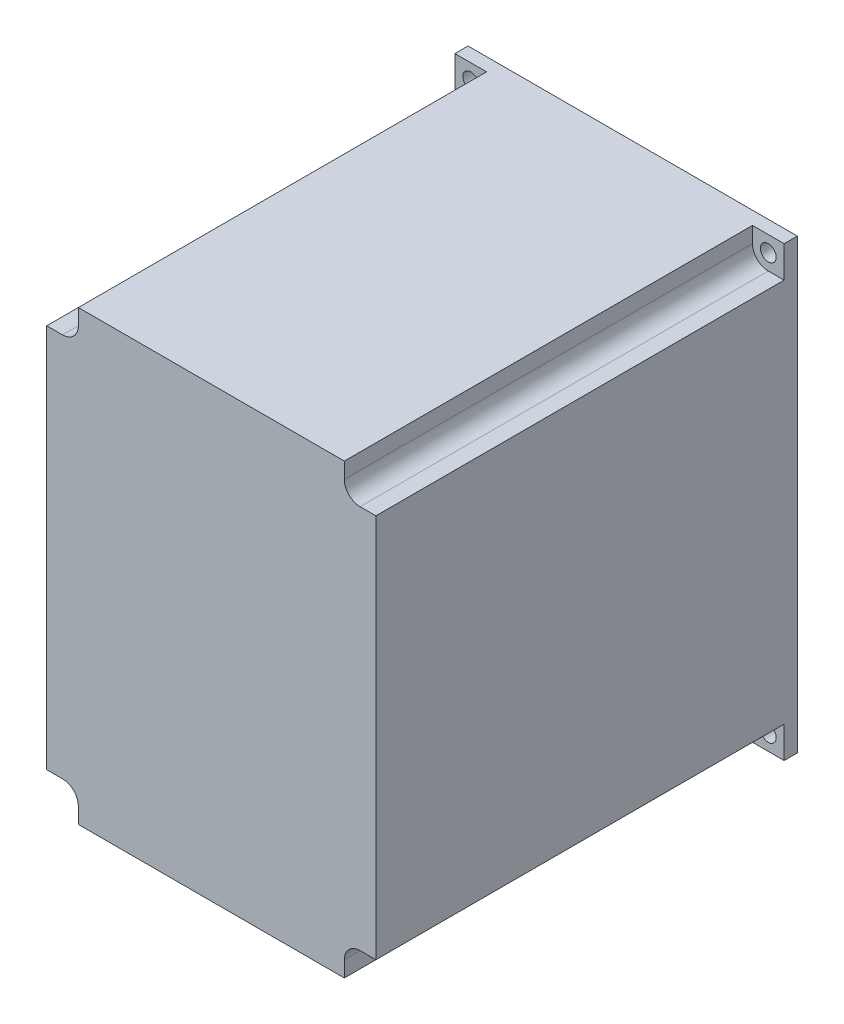
ISO-10303-21;
HEADER;
FILE_DESCRIPTION(('STEP AP214'),'2;1');
FILE_NAME('part.step','',(''),(''),'','','');
FILE_SCHEMA(('AUTOMOTIVE_DESIGN { 1 0 10303 214 1 1 1 1 }'));
ENDSEC;
DATA;
#1=APPLICATION_CONTEXT('core data for automotive mechanical design processes');
#2=APPLICATION_PROTOCOL_DEFINITION('international standard','automotive_design',2000,#1);
#3=PRODUCT_CONTEXT('',#1,'mechanical');
#4=PRODUCT('Part','Part','',(#3));
#5=PRODUCT_RELATED_PRODUCT_CATEGORY('part','',(#4));
#6=PRODUCT_DEFINITION_FORMATION('','',#4);
#7=PRODUCT_DEFINITION_CONTEXT('part definition',#1,'design');
#8=PRODUCT_DEFINITION('design','',#6,#7);
#9=PRODUCT_DEFINITION_SHAPE('','',#8);
#10=(LENGTH_UNIT() NAMED_UNIT(*) SI_UNIT(.MILLI.,.METRE.));
#11=(NAMED_UNIT(*) PLANE_ANGLE_UNIT() SI_UNIT($,.RADIAN.));
#12=(NAMED_UNIT(*) SI_UNIT($,.STERADIAN.) SOLID_ANGLE_UNIT());
#13=UNCERTAINTY_MEASURE_WITH_UNIT(LENGTH_MEASURE(1.E-05),#10,'distance_accuracy_value','');
#14=(GEOMETRIC_REPRESENTATION_CONTEXT(3) GLOBAL_UNCERTAINTY_ASSIGNED_CONTEXT((#13)) GLOBAL_UNIT_ASSIGNED_CONTEXT((#10,
#11,#12)) REPRESENTATION_CONTEXT('',''));
#15=CARTESIAN_POINT('',(0.,0.,0.));
#16=DIRECTION('',(0.,0.,1.));
#17=DIRECTION('',(1.,0.,0.));
#18=AXIS2_PLACEMENT_3D('',#15,#16,#17);
#19=CARTESIAN_POINT('',(62.5,85.,160.));
#20=DIRECTION('',(-1.,0.,0.));
#21=DIRECTION('',(0.,-1.,0.));
#22=AXIS2_PLACEMENT_3D('',#19,#20,#21);
#23=PLANE('',#22);
#24=DIRECTION('',(0.,1.,0.));
#25=VECTOR('',#24,1.);
#26=CARTESIAN_POINT('',(62.5,0.,5.));
#27=LINE('',#26,#25);
#28=CARTESIAN_POINT('',(62.5,73.,5.));
#29=VERTEX_POINT('',#28);
#30=CARTESIAN_POINT('',(62.5,85.,5.));
#31=VERTEX_POINT('',#30);
#32=EDGE_CURVE('E203',#29,#31,#27,.T.);
#33=ORIENTED_EDGE('',*,*,#32,.F.);
#34=DIRECTION('',(0.,0.,1.));
#35=VECTOR('',#34,1.);
#36=CARTESIAN_POINT('',(62.5,73.,-16.9705627484771));
#37=LINE('',#36,#35);
#38=CARTESIAN_POINT('',(62.5,73.,160.));
#39=VERTEX_POINT('',#38);
#40=EDGE_CURVE('E190',#29,#39,#37,.T.);
#41=ORIENTED_EDGE('',*,*,#40,.T.);
#42=DIRECTION('',(0.,1.,0.));
#43=VECTOR('',#42,1.);
#44=CARTESIAN_POINT('',(62.5,85.,160.));
#45=LINE('',#44,#43);
#46=CARTESIAN_POINT('',(62.5,-73.,160.));
#47=VERTEX_POINT('',#46);
#48=EDGE_CURVE('E201',#47,#39,#45,.T.);
#49=ORIENTED_EDGE('',*,*,#48,.F.);
#50=DIRECTION('',(0.,0.,1.));
#51=VECTOR('',#50,1.);
#52=CARTESIAN_POINT('',(62.5,-73.,-16.9705627484771));
#53=LINE('',#52,#51);
#54=CARTESIAN_POINT('',(62.5,-73.,5.));
#55=VERTEX_POINT('',#54);
#56=EDGE_CURVE('E289',#55,#47,#53,.T.);
#57=ORIENTED_EDGE('',*,*,#56,.F.);
#58=DIRECTION('',(0.,-1.,0.));
#59=VECTOR('',#58,1.);
#60=CARTESIAN_POINT('',(62.5,0.,5.));
#61=LINE('',#60,#59);
#62=CARTESIAN_POINT('',(62.5,-85.,5.));
#63=VERTEX_POINT('',#62);
#64=EDGE_CURVE('E273',#55,#63,#61,.T.);
#65=ORIENTED_EDGE('',*,*,#64,.T.);
#66=DIRECTION('',(0.,0.,-1.));
#67=VECTOR('',#66,1.);
#68=CARTESIAN_POINT('',(62.5,-85.,160.));
#69=LINE('',#68,#67);
#70=CARTESIAN_POINT('',(62.5,-85.,0.));
#71=VERTEX_POINT('',#70);
#72=EDGE_CURVE('E227',#63,#71,#69,.T.);
#73=ORIENTED_EDGE('',*,*,#72,.T.);
#74=DIRECTION('',(0.,1.,0.));
#75=VECTOR('',#74,1.);
#76=CARTESIAN_POINT('',(62.5,85.,0.));
#77=LINE('',#76,#75);
#78=CARTESIAN_POINT('',(62.5,85.,0.));
#79=VERTEX_POINT('',#78);
#80=EDGE_CURVE('E228',#71,#79,#77,.T.);
#81=ORIENTED_EDGE('',*,*,#80,.T.);
#82=DIRECTION('',(0.,0.,-1.));
#83=VECTOR('',#82,1.);
#84=CARTESIAN_POINT('',(62.5,85.,160.));
#85=LINE('',#84,#83);
#86=EDGE_CURVE('E12',#31,#79,#85,.T.);
#87=ORIENTED_EDGE('',*,*,#86,.F.);
#88=EDGE_LOOP('',(#33,#41,#49,#57,#65,#73,#81,#87));
#89=FACE_BOUND('',#88,.T.);
#90=ADVANCED_FACE('F42',(#89),#23,.F.);
#91=CARTESIAN_POINT('',(-62.5,-85.,160.));
#92=DIRECTION('',(0.,1.,0.));
#93=DIRECTION('',(0.,0.,1.));
#94=AXIS2_PLACEMENT_3D('',#91,#92,#93);
#95=PLANE('',#94);
#96=DIRECTION('',(0.,0.,1.));
#97=VECTOR('',#96,1.);
#98=CARTESIAN_POINT('',(50.5,-85.,-16.9705627484771));
#99=LINE('',#98,#97);
#100=CARTESIAN_POINT('',(50.5,-85.,5.));
#101=VERTEX_POINT('',#100);
#102=CARTESIAN_POINT('',(50.5,-85.,160.));
#103=VERTEX_POINT('',#102);
#104=EDGE_CURVE('E291',#101,#103,#99,.T.);
#105=ORIENTED_EDGE('',*,*,#104,.T.);
#106=DIRECTION('',(1.,0.,0.));
#107=VECTOR('',#106,1.);
#108=CARTESIAN_POINT('',(-62.5,-85.,160.));
#109=LINE('',#108,#107);
#110=CARTESIAN_POINT('',(-50.5,-85.,160.));
#111=VERTEX_POINT('',#110);
#112=EDGE_CURVE('E224',#111,#103,#109,.T.);
#113=ORIENTED_EDGE('',*,*,#112,.F.);
#114=DIRECTION('',(0.,0.,1.));
#115=VECTOR('',#114,1.);
#116=CARTESIAN_POINT('',(-50.5,-85.,-16.9705627484771));
#117=LINE('',#116,#115);
#118=CARTESIAN_POINT('',(-50.5,-85.,5.));
#119=VERTEX_POINT('',#118);
#120=EDGE_CURVE('E318',#119,#111,#117,.T.);
#121=ORIENTED_EDGE('',*,*,#120,.F.);
#122=DIRECTION('',(1.,0.,0.));
#123=VECTOR('',#122,1.);
#124=CARTESIAN_POINT('',(0.,-85.,5.));
#125=LINE('',#124,#123);
#126=CARTESIAN_POINT('',(-62.5,-85.,5.));
#127=VERTEX_POINT('',#126);
#128=EDGE_CURVE('E301',#127,#119,#125,.T.);
#129=ORIENTED_EDGE('',*,*,#128,.F.);
#130=DIRECTION('',(0.,0.,-1.));
#131=VECTOR('',#130,1.);
#132=CARTESIAN_POINT('',(-62.5,-85.,160.));
#133=LINE('',#132,#131);
#134=CARTESIAN_POINT('',(-62.5,-85.,0.));
#135=VERTEX_POINT('',#134);
#136=EDGE_CURVE('E240',#127,#135,#133,.T.);
#137=ORIENTED_EDGE('',*,*,#136,.T.);
#138=DIRECTION('',(1.,0.,0.));
#139=VECTOR('',#138,1.);
#140=CARTESIAN_POINT('',(-62.5,-85.,0.));
#141=LINE('',#140,#139);
#142=EDGE_CURVE('E211',#135,#71,#141,.T.);
#143=ORIENTED_EDGE('',*,*,#142,.T.);
#144=ORIENTED_EDGE('',*,*,#72,.F.);
#145=DIRECTION('',(-1.,0.,0.));
#146=VECTOR('',#145,1.);
#147=CARTESIAN_POINT('',(0.,-85.,5.));
#148=LINE('',#147,#146);
#149=EDGE_CURVE('E270',#63,#101,#148,.T.);
#150=ORIENTED_EDGE('',*,*,#149,.T.);
#151=EDGE_LOOP('',(#105,#113,#121,#129,#137,#143,#144,#150));
#152=FACE_BOUND('',#151,.T.);
#153=ADVANCED_FACE('F401',(#152),#95,.F.);
#154=CARTESIAN_POINT('',(-62.5,85.,160.));
#155=DIRECTION('',(0.,-1.,0.));
#156=DIRECTION('',(0.,0.,-1.));
#157=AXIS2_PLACEMENT_3D('',#154,#155,#156);
#158=PLANE('',#157);
#159=DIRECTION('',(-1.,0.,0.));
#160=VECTOR('',#159,1.);
#161=CARTESIAN_POINT('',(-62.5,85.,160.));
#162=LINE('',#161,#160);
#163=CARTESIAN_POINT('',(50.5,85.,160.));
#164=VERTEX_POINT('',#163);
#165=CARTESIAN_POINT('',(-50.5,85.,160.));
#166=VERTEX_POINT('',#165);
#167=EDGE_CURVE('E210',#164,#166,#162,.T.);
#168=ORIENTED_EDGE('',*,*,#167,.F.);
#169=DIRECTION('',(0.,0.,1.));
#170=VECTOR('',#169,1.);
#171=CARTESIAN_POINT('',(50.5,85.,-16.9705627484771));
#172=LINE('',#171,#170);
#173=CARTESIAN_POINT('',(50.5,85.,5.));
#174=VERTEX_POINT('',#173);
#175=EDGE_CURVE('E205',#174,#164,#172,.T.);
#176=ORIENTED_EDGE('',*,*,#175,.F.);
#177=DIRECTION('',(-1.,0.,0.));
#178=VECTOR('',#177,1.);
#179=CARTESIAN_POINT('',(0.,85.,5.));
#180=LINE('',#179,#178);
#181=EDGE_CURVE('E420',#31,#174,#180,.T.);
#182=ORIENTED_EDGE('',*,*,#181,.F.);
#183=ORIENTED_EDGE('',*,*,#86,.T.);
#184=DIRECTION('',(-1.,0.,0.));
#185=VECTOR('',#184,1.);
#186=CARTESIAN_POINT('',(-62.5,85.,0.));
#187=LINE('',#186,#185);
#188=CARTESIAN_POINT('',(-62.5,85.,0.));
#189=VERTEX_POINT('',#188);
#190=EDGE_CURVE('E232',#79,#189,#187,.T.);
#191=ORIENTED_EDGE('',*,*,#190,.T.);
#192=DIRECTION('',(0.,0.,-1.));
#193=VECTOR('',#192,1.);
#194=CARTESIAN_POINT('',(-62.5,85.,160.));
#195=LINE('',#194,#193);
#196=CARTESIAN_POINT('',(-62.5,85.,5.));
#197=VERTEX_POINT('',#196);
#198=EDGE_CURVE('E51',#197,#189,#195,.T.);
#199=ORIENTED_EDGE('',*,*,#198,.F.);
#200=DIRECTION('',(1.,0.,0.));
#201=VECTOR('',#200,1.);
#202=CARTESIAN_POINT('',(0.,85.,5.));
#203=LINE('',#202,#201);
#204=CARTESIAN_POINT('',(-50.5,85.,5.));
#205=VERTEX_POINT('',#204);
#206=EDGE_CURVE('E328',#197,#205,#203,.T.);
#207=ORIENTED_EDGE('',*,*,#206,.T.);
#208=DIRECTION('',(0.,0.,1.));
#209=VECTOR('',#208,1.);
#210=CARTESIAN_POINT('',(-50.5,85.,-16.9705627484771));
#211=LINE('',#210,#209);
#212=EDGE_CURVE('E353',#205,#166,#211,.T.);
#213=ORIENTED_EDGE('',*,*,#212,.T.);
#214=EDGE_LOOP('',(#168,#176,#182,#183,#191,#199,#207,#213));
#215=FACE_BOUND('',#214,.T.);
#216=ADVANCED_FACE('F368',(#215),#158,.F.);
#217=CARTESIAN_POINT('',(-62.5,85.,160.));
#218=DIRECTION('',(1.,0.,0.));
#219=DIRECTION('',(0.,1.,0.));
#220=AXIS2_PLACEMENT_3D('',#217,#218,#219);
#221=PLANE('',#220);
#222=DIRECTION('',(0.,-1.,0.));
#223=VECTOR('',#222,1.);
#224=CARTESIAN_POINT('',(-62.5,0.,5.));
#225=LINE('',#224,#223);
#226=CARTESIAN_POINT('',(-62.5,-73.,5.));
#227=VERTEX_POINT('',#226);
#228=EDGE_CURVE('E299',#227,#127,#225,.T.);
#229=ORIENTED_EDGE('',*,*,#228,.F.);
#230=DIRECTION('',(0.,0.,1.));
#231=VECTOR('',#230,1.);
#232=CARTESIAN_POINT('',(-62.5,-73.,-16.9705627484771));
#233=LINE('',#232,#231);
#234=CARTESIAN_POINT('',(-62.5,-73.,160.));
#235=VERTEX_POINT('',#234);
#236=EDGE_CURVE('E320',#227,#235,#233,.T.);
#237=ORIENTED_EDGE('',*,*,#236,.T.);
#238=DIRECTION('',(0.,-1.,0.));
#239=VECTOR('',#238,1.);
#240=CARTESIAN_POINT('',(-62.5,85.,160.));
#241=LINE('',#240,#239);
#242=CARTESIAN_POINT('',(-62.5,73.,160.));
#243=VERTEX_POINT('',#242);
#244=EDGE_CURVE('E213',#243,#235,#241,.T.);
#245=ORIENTED_EDGE('',*,*,#244,.F.);
#246=DIRECTION('',(0.,0.,1.));
#247=VECTOR('',#246,1.);
#248=CARTESIAN_POINT('',(-62.5,73.,-16.9705627484771));
#249=LINE('',#248,#247);
#250=CARTESIAN_POINT('',(-62.5,73.,5.));
#251=VERTEX_POINT('',#250);
#252=EDGE_CURVE('E351',#251,#243,#249,.T.);
#253=ORIENTED_EDGE('',*,*,#252,.F.);
#254=DIRECTION('',(0.,1.,0.));
#255=VECTOR('',#254,1.);
#256=CARTESIAN_POINT('',(-62.5,0.,5.));
#257=LINE('',#256,#255);
#258=EDGE_CURVE('E331',#251,#197,#257,.T.);
#259=ORIENTED_EDGE('',*,*,#258,.T.);
#260=ORIENTED_EDGE('',*,*,#198,.T.);
#261=DIRECTION('',(0.,-1.,0.));
#262=VECTOR('',#261,1.);
#263=CARTESIAN_POINT('',(-62.5,85.,0.));
#264=LINE('',#263,#262);
#265=EDGE_CURVE('E216',#189,#135,#264,.T.);
#266=ORIENTED_EDGE('',*,*,#265,.T.);
#267=ORIENTED_EDGE('',*,*,#136,.F.);
#268=EDGE_LOOP('',(#229,#237,#245,#253,#259,#260,#266,#267));
#269=FACE_BOUND('',#268,.T.);
#270=ADVANCED_FACE('F381',(#269),#221,.F.);
#271=CARTESIAN_POINT('',(0.,0.,160.));
#272=DIRECTION('',(0.,0.,1.));
#273=DIRECTION('',(1.,0.,0.));
#274=AXIS2_PLACEMENT_3D('',#271,#272,#273);
#275=PLANE('',#274);
#276=DIRECTION('',(0.,-1.,0.));
#277=VECTOR('',#276,1.);
#278=CARTESIAN_POINT('',(50.5,0.,160.));
#279=LINE('',#278,#277);
#280=CARTESIAN_POINT('',(50.5,79.,160.));
#281=VERTEX_POINT('',#280);
#282=EDGE_CURVE('E195',#164,#281,#279,.T.);
#283=ORIENTED_EDGE('',*,*,#282,.F.);
#284=ORIENTED_EDGE('',*,*,#167,.T.);
#285=DIRECTION('',(0.,-1.,0.));
#286=VECTOR('',#285,1.);
#287=CARTESIAN_POINT('',(-50.5,0.,160.));
#288=LINE('',#287,#286);
#289=CARTESIAN_POINT('',(-50.5,79.,160.));
#290=VERTEX_POINT('',#289);
#291=EDGE_CURVE('E341',#166,#290,#288,.T.);
#292=ORIENTED_EDGE('',*,*,#291,.T.);
#293=CARTESIAN_POINT('',(-56.5,79.,160.));
#294=DIRECTION('',(0.,0.,1.));
#295=DIRECTION('',(1.,0.,0.));
#296=AXIS2_PLACEMENT_3D('',#293,#294,#295);
#297=CIRCLE('',#296,6.);
#298=CARTESIAN_POINT('',(-56.5,73.,160.));
#299=VERTEX_POINT('',#298);
#300=EDGE_CURVE('E246',#290,#299,#297,.F.);
#301=ORIENTED_EDGE('',*,*,#300,.T.);
#302=DIRECTION('',(-1.,0.,0.));
#303=VECTOR('',#302,1.);
#304=CARTESIAN_POINT('',(-3.3769283665682E-13,73.0000000000003,160.));
#305=LINE('',#304,#303);
#306=EDGE_CURVE('E344',#299,#243,#305,.T.);
#307=ORIENTED_EDGE('',*,*,#306,.T.);
#308=ORIENTED_EDGE('',*,*,#244,.T.);
#309=DIRECTION('',(-1.,0.,0.));
#310=VECTOR('',#309,1.);
#311=CARTESIAN_POINT('',(-3.3769283665682E-13,-73.0000000000003,160.));
#312=LINE('',#311,#310);
#313=CARTESIAN_POINT('',(-56.5,-73.,160.));
#314=VERTEX_POINT('',#313);
#315=EDGE_CURVE('E311',#314,#235,#312,.T.);
#316=ORIENTED_EDGE('',*,*,#315,.F.);
#317=CARTESIAN_POINT('',(-56.5,-79.,160.));
#318=DIRECTION('',(0.,0.,-1.));
#319=DIRECTION('',(1.,0.,0.));
#320=AXIS2_PLACEMENT_3D('',#317,#318,#319);
#321=CIRCLE('',#320,6.);
#322=CARTESIAN_POINT('',(-50.5,-79.,160.));
#323=VERTEX_POINT('',#322);
#324=EDGE_CURVE('E250',#323,#314,#321,.F.);
#325=ORIENTED_EDGE('',*,*,#324,.F.);
#326=DIRECTION('',(0.,1.,0.));
#327=VECTOR('',#326,1.);
#328=CARTESIAN_POINT('',(-50.5,0.,160.));
#329=LINE('',#328,#327);
#330=EDGE_CURVE('E313',#111,#323,#329,.T.);
#331=ORIENTED_EDGE('',*,*,#330,.F.);
#332=ORIENTED_EDGE('',*,*,#112,.T.);
#333=DIRECTION('',(0.,1.,0.));
#334=VECTOR('',#333,1.);
#335=CARTESIAN_POINT('',(50.5,0.,160.));
#336=LINE('',#335,#334);
#337=CARTESIAN_POINT('',(50.5,-79.,160.));
#338=VERTEX_POINT('',#337);
#339=EDGE_CURVE('E258',#103,#338,#336,.T.);
#340=ORIENTED_EDGE('',*,*,#339,.T.);
#341=CARTESIAN_POINT('',(56.5,-79.,160.));
#342=DIRECTION('',(0.,0.,1.));
#343=DIRECTION('',(-1.,0.,0.));
#344=AXIS2_PLACEMENT_3D('',#341,#342,#343);
#345=CIRCLE('',#344,6.);
#346=CARTESIAN_POINT('',(56.5,-73.,160.));
#347=VERTEX_POINT('',#346);
#348=EDGE_CURVE('E254',#338,#347,#345,.F.);
#349=ORIENTED_EDGE('',*,*,#348,.T.);
#350=DIRECTION('',(1.,0.,0.));
#351=VECTOR('',#350,1.);
#352=CARTESIAN_POINT('',(3.3769283665682E-13,-73.0000000000003,160.));
#353=LINE('',#352,#351);
#354=EDGE_CURVE('E67',#347,#47,#353,.T.);
#355=ORIENTED_EDGE('',*,*,#354,.T.);
#356=ORIENTED_EDGE('',*,*,#48,.T.);
#357=DIRECTION('',(1.,0.,0.));
#358=VECTOR('',#357,1.);
#359=CARTESIAN_POINT('',(3.3769283665682E-13,73.0000000000003,160.));
#360=LINE('',#359,#358);
#361=CARTESIAN_POINT('',(56.5,73.,160.));
#362=VERTEX_POINT('',#361);
#363=EDGE_CURVE('E187',#362,#39,#360,.T.);
#364=ORIENTED_EDGE('',*,*,#363,.F.);
#365=CARTESIAN_POINT('',(56.5,79.,160.));
#366=DIRECTION('',(0.,0.,-1.));
#367=DIRECTION('',(-1.,0.,0.));
#368=AXIS2_PLACEMENT_3D('',#365,#366,#367);
#369=CIRCLE('',#368,6.);
#370=EDGE_CURVE('E59',#281,#362,#369,.F.);
#371=ORIENTED_EDGE('',*,*,#370,.F.);
#372=EDGE_LOOP('',(#283,#284,#292,#301,#307,#308,#316,#325,#331,#332,#340,#349,#355,#356,#364,#371));
#373=FACE_BOUND('',#372,.T.);
#374=ADVANCED_FACE('F208',(#373),#275,.T.);
#375=CARTESIAN_POINT('',(0.,0.,0.));
#376=DIRECTION('',(0.,0.,1.));
#377=DIRECTION('',(1.,0.,0.));
#378=AXIS2_PLACEMENT_3D('',#375,#376,#377);
#379=PLANE('',#378);
#380=CARTESIAN_POINT('',(56.5,79.,0.));
#381=DIRECTION('',(0.,0.,-1.));
#382=DIRECTION('',(-1.,0.,0.));
#383=AXIS2_PLACEMENT_3D('',#380,#381,#382);
#384=CIRCLE('',#383,3.);
#385=CARTESIAN_POINT('',(53.5,79.,0.));
#386=VERTEX_POINT('',#385);
#387=EDGE_CURVE('E443',#386,#386,#384,.T.);
#388=ORIENTED_EDGE('',*,*,#387,.F.);
#389=EDGE_LOOP('',(#388));
#390=FACE_BOUND('',#389,.T.);
#391=CARTESIAN_POINT('',(56.5,-79.,0.));
#392=DIRECTION('',(0.,0.,1.));
#393=DIRECTION('',(-1.,0.,0.));
#394=AXIS2_PLACEMENT_3D('',#391,#392,#393);
#395=CIRCLE('',#394,3.);
#396=CARTESIAN_POINT('',(53.5,-79.,0.));
#397=VERTEX_POINT('',#396);
#398=EDGE_CURVE('E255',#397,#397,#395,.T.);
#399=ORIENTED_EDGE('',*,*,#398,.T.);
#400=EDGE_LOOP('',(#399));
#401=FACE_BOUND('',#400,.T.);
#402=CARTESIAN_POINT('',(-56.5,-79.,0.));
#403=DIRECTION('',(0.,0.,-1.));
#404=DIRECTION('',(1.,0.,0.));
#405=AXIS2_PLACEMENT_3D('',#402,#403,#404);
#406=CIRCLE('',#405,3.);
#407=CARTESIAN_POINT('',(-53.5,-79.,0.));
#408=VERTEX_POINT('',#407);
#409=EDGE_CURVE('E251',#408,#408,#406,.T.);
#410=ORIENTED_EDGE('',*,*,#409,.F.);
#411=EDGE_LOOP('',(#410));
#412=FACE_BOUND('',#411,.T.);
#413=CARTESIAN_POINT('',(-56.5,79.,0.));
#414=DIRECTION('',(0.,0.,1.));
#415=DIRECTION('',(1.,0.,0.));
#416=AXIS2_PLACEMENT_3D('',#413,#414,#415);
#417=CIRCLE('',#416,3.);
#418=CARTESIAN_POINT('',(-53.5,79.,0.));
#419=VERTEX_POINT('',#418);
#420=EDGE_CURVE('E247',#419,#419,#417,.T.);
#421=ORIENTED_EDGE('',*,*,#420,.T.);
#422=EDGE_LOOP('',(#421));
#423=FACE_BOUND('',#422,.T.);
#424=ORIENTED_EDGE('',*,*,#80,.F.);
#425=ORIENTED_EDGE('',*,*,#142,.F.);
#426=ORIENTED_EDGE('',*,*,#265,.F.);
#427=ORIENTED_EDGE('',*,*,#190,.F.);
#428=EDGE_LOOP('',(#424,#425,#426,#427));
#429=FACE_BOUND('',#428,.T.);
#430=ADVANCED_FACE('F418',(#390,#401,#412,#423,#429),#379,.F.);
#431=CARTESIAN_POINT('',(-50.5,0.,-16.9705627484771));
#432=DIRECTION('',(-1.,0.,0.));
#433=DIRECTION('',(0.,0.,1.));
#434=AXIS2_PLACEMENT_3D('',#431,#432,#433);
#435=PLANE('',#434);
#436=DIRECTION('',(0.,0.,1.));
#437=VECTOR('',#436,1.);
#438=CARTESIAN_POINT('',(-50.5,79.,-16.9705627484771));
#439=LINE('',#438,#437);
#440=CARTESIAN_POINT('',(-50.5,79.,5.));
#441=VERTEX_POINT('',#440);
#442=EDGE_CURVE('E347',#441,#290,#439,.T.);
#443=ORIENTED_EDGE('',*,*,#442,.T.);
#444=ORIENTED_EDGE('',*,*,#291,.F.);
#445=ORIENTED_EDGE('',*,*,#212,.F.);
#446=DIRECTION('',(0.,1.,0.));
#447=VECTOR('',#446,1.);
#448=CARTESIAN_POINT('',(-50.5,0.,5.));
#449=LINE('',#448,#447);
#450=EDGE_CURVE('E219',#441,#205,#449,.T.);
#451=ORIENTED_EDGE('',*,*,#450,.F.);
#452=EDGE_LOOP('',(#443,#444,#445,#451));
#453=FACE_BOUND('',#452,.T.);
#454=ADVANCED_FACE('F359',(#453),#435,.T.);
#455=CARTESIAN_POINT('',(-3.3769283665682E-13,73.0000000000003,-16.9705627484771));
#456=DIRECTION('',(0.,1.,0.));
#457=DIRECTION('',(-1.,0.,0.));
#458=AXIS2_PLACEMENT_3D('',#455,#456,#457);
#459=PLANE('',#458);
#460=ORIENTED_EDGE('',*,*,#252,.T.);
#461=ORIENTED_EDGE('',*,*,#306,.F.);
#462=DIRECTION('',(0.,0.,1.));
#463=VECTOR('',#462,1.);
#464=CARTESIAN_POINT('',(-56.5,73.,-16.9705627484771));
#465=LINE('',#464,#463);
#466=CARTESIAN_POINT('',(-56.5,73.,5.));
#467=VERTEX_POINT('',#466);
#468=EDGE_CURVE('E348',#467,#299,#465,.T.);
#469=ORIENTED_EDGE('',*,*,#468,.F.);
#470=DIRECTION('',(1.,0.,0.));
#471=VECTOR('',#470,1.);
#472=CARTESIAN_POINT('',(-3.3769283665682E-13,73.0000000000003,5.));
#473=LINE('',#472,#471);
#474=EDGE_CURVE('E334',#251,#467,#473,.T.);
#475=ORIENTED_EDGE('',*,*,#474,.F.);
#476=EDGE_LOOP('',(#460,#461,#469,#475));
#477=FACE_BOUND('',#476,.T.);
#478=ADVANCED_FACE('F375',(#477),#459,.T.);
#479=CARTESIAN_POINT('',(-56.5,79.,-16.9705627484771));
#480=DIRECTION('',(0.,0.,1.));
#481=DIRECTION('',(1.,0.,0.));
#482=AXIS2_PLACEMENT_3D('',#479,#480,#481);
#483=CYLINDRICAL_SURFACE('',#482,6.);
#484=ORIENTED_EDGE('',*,*,#468,.T.);
#485=ORIENTED_EDGE('',*,*,#300,.F.);
#486=ORIENTED_EDGE('',*,*,#442,.F.);
#487=CARTESIAN_POINT('',(-56.5,79.,5.));
#488=DIRECTION('',(0.,0.,1.));
#489=DIRECTION('',(1.,0.,0.));
#490=AXIS2_PLACEMENT_3D('',#487,#488,#489);
#491=CIRCLE('',#490,6.);
#492=EDGE_CURVE('E233',#467,#441,#491,.T.);
#493=ORIENTED_EDGE('',*,*,#492,.F.);
#494=EDGE_LOOP('',(#484,#485,#486,#493));
#495=FACE_BOUND('',#494,.T.);
#496=ADVANCED_FACE('F362',(#495),#483,.F.);
#497=CARTESIAN_POINT('',(0.,0.,5.));
#498=DIRECTION('',(0.,0.,1.));
#499=DIRECTION('',(1.,0.,0.));
#500=AXIS2_PLACEMENT_3D('',#497,#498,#499);
#501=PLANE('',#500);
#502=CARTESIAN_POINT('',(-56.5,79.,5.));
#503=DIRECTION('',(0.,0.,1.));
#504=DIRECTION('',(1.,0.,0.));
#505=AXIS2_PLACEMENT_3D('',#502,#503,#504);
#506=CIRCLE('',#505,3.);
#507=CARTESIAN_POINT('',(-53.5,79.,5.));
#508=VERTEX_POINT('',#507);
#509=EDGE_CURVE('E243',#508,#508,#506,.T.);
#510=ORIENTED_EDGE('',*,*,#509,.F.);
#511=EDGE_LOOP('',(#510));
#512=FACE_BOUND('',#511,.T.);
#513=ORIENTED_EDGE('',*,*,#474,.T.);
#514=ORIENTED_EDGE('',*,*,#492,.T.);
#515=ORIENTED_EDGE('',*,*,#450,.T.);
#516=ORIENTED_EDGE('',*,*,#206,.F.);
#517=ORIENTED_EDGE('',*,*,#258,.F.);
#518=EDGE_LOOP('',(#513,#514,#515,#516,#517));
#519=FACE_BOUND('',#518,.T.);
#520=ADVANCED_FACE('F372',(#512,#519),#501,.T.);
#521=CARTESIAN_POINT('',(-56.5,79.,0.));
#522=DIRECTION('',(0.,0.,1.));
#523=DIRECTION('',(1.,0.,0.));
#524=AXIS2_PLACEMENT_3D('',#521,#522,#523);
#525=CYLINDRICAL_SURFACE('',#524,3.);
#526=ORIENTED_EDGE('',*,*,#509,.T.);
#527=EDGE_LOOP('',(#526));
#528=FACE_BOUND('',#527,.T.);
#529=ORIENTED_EDGE('',*,*,#420,.F.);
#530=EDGE_LOOP('',(#529));
#531=FACE_BOUND('',#530,.T.);
#532=ADVANCED_FACE('F487',(#528,#531),#525,.F.);
#533=CARTESIAN_POINT('',(-56.5,-79.,-16.9705627484771));
#534=DIRECTION('',(0.,0.,1.));
#535=DIRECTION('',(1.,0.,0.));
#536=AXIS2_PLACEMENT_3D('',#533,#534,#535);
#537=CYLINDRICAL_SURFACE('',#536,6.);
#538=CARTESIAN_POINT('',(-56.5,-79.,5.));
#539=DIRECTION('',(0.,0.,1.));
#540=DIRECTION('',(1.,0.,0.));
#541=AXIS2_PLACEMENT_3D('',#538,#539,#540);
#542=CIRCLE('',#541,6.);
#543=CARTESIAN_POINT('',(-56.5,-73.,5.));
#544=VERTEX_POINT('',#543);
#545=CARTESIAN_POINT('',(-50.5,-79.,5.));
#546=VERTEX_POINT('',#545);
#547=EDGE_CURVE('E307',#544,#546,#542,.F.);
#548=ORIENTED_EDGE('',*,*,#547,.T.);
#549=DIRECTION('',(0.,0.,1.));
#550=VECTOR('',#549,1.);
#551=CARTESIAN_POINT('',(-50.5,-79.,-16.9705627484771));
#552=LINE('',#551,#550);
#553=EDGE_CURVE('E302',#546,#323,#552,.T.);
#554=ORIENTED_EDGE('',*,*,#553,.T.);
#555=ORIENTED_EDGE('',*,*,#324,.T.);
#556=DIRECTION('',(0.,0.,1.));
#557=VECTOR('',#556,1.);
#558=CARTESIAN_POINT('',(-56.5,-73.,-16.9705627484771));
#559=LINE('',#558,#557);
#560=EDGE_CURVE('E316',#544,#314,#559,.T.);
#561=ORIENTED_EDGE('',*,*,#560,.F.);
#562=EDGE_LOOP('',(#548,#554,#555,#561));
#563=FACE_BOUND('',#562,.T.);
#564=ADVANCED_FACE('F394',(#563),#537,.F.);
#565=CARTESIAN_POINT('',(-50.5,0.,-16.9705627484771));
#566=DIRECTION('',(1.,0.,0.));
#567=DIRECTION('',(0.,0.,-1.));
#568=AXIS2_PLACEMENT_3D('',#565,#566,#567);
#569=PLANE('',#568);
#570=DIRECTION('',(0.,-1.,0.));
#571=VECTOR('',#570,1.);
#572=CARTESIAN_POINT('',(-50.5,0.,5.));
#573=LINE('',#572,#571);
#574=EDGE_CURVE('E305',#546,#119,#573,.T.);
#575=ORIENTED_EDGE('',*,*,#574,.T.);
#576=ORIENTED_EDGE('',*,*,#120,.T.);
#577=ORIENTED_EDGE('',*,*,#330,.T.);
#578=ORIENTED_EDGE('',*,*,#553,.F.);
#579=EDGE_LOOP('',(#575,#576,#577,#578));
#580=FACE_BOUND('',#579,.T.);
#581=ADVANCED_FACE('F494',(#580),#569,.F.);
#582=CARTESIAN_POINT('',(-3.3769283665682E-13,-73.0000000000003,-16.9705627484771));
#583=DIRECTION('',(0.,1.,0.));
#584=DIRECTION('',(-1.,0.,0.));
#585=AXIS2_PLACEMENT_3D('',#582,#583,#584);
#586=PLANE('',#585);
#587=DIRECTION('',(1.,0.,0.));
#588=VECTOR('',#587,1.);
#589=CARTESIAN_POINT('',(-3.3769283665682E-13,-73.0000000000003,5.));
#590=LINE('',#589,#588);
#591=EDGE_CURVE('E309',#227,#544,#590,.T.);
#592=ORIENTED_EDGE('',*,*,#591,.T.);
#593=ORIENTED_EDGE('',*,*,#560,.T.);
#594=ORIENTED_EDGE('',*,*,#315,.T.);
#595=ORIENTED_EDGE('',*,*,#236,.F.);
#596=EDGE_LOOP('',(#592,#593,#594,#595));
#597=FACE_BOUND('',#596,.T.);
#598=ADVANCED_FACE('F385',(#597),#586,.F.);
#599=CARTESIAN_POINT('',(0.,0.,5.));
#600=DIRECTION('',(0.,0.,1.));
#601=DIRECTION('',(1.,0.,0.));
#602=AXIS2_PLACEMENT_3D('',#599,#600,#601);
#603=PLANE('',#602);
#604=CARTESIAN_POINT('',(-56.5,-79.,5.));
#605=DIRECTION('',(0.,0.,1.));
#606=DIRECTION('',(1.,0.,0.));
#607=AXIS2_PLACEMENT_3D('',#604,#605,#606);
#608=CIRCLE('',#607,3.);
#609=CARTESIAN_POINT('',(-53.5,-79.,5.));
#610=VERTEX_POINT('',#609);
#611=EDGE_CURVE('E248',#610,#610,#608,.F.);
#612=ORIENTED_EDGE('',*,*,#611,.T.);
#613=EDGE_LOOP('',(#612));
#614=FACE_BOUND('',#613,.T.);
#615=ORIENTED_EDGE('',*,*,#547,.F.);
#616=ORIENTED_EDGE('',*,*,#591,.F.);
#617=ORIENTED_EDGE('',*,*,#228,.T.);
#618=ORIENTED_EDGE('',*,*,#128,.T.);
#619=ORIENTED_EDGE('',*,*,#574,.F.);
#620=EDGE_LOOP('',(#615,#616,#617,#618,#619));
#621=FACE_BOUND('',#620,.T.);
#622=ADVANCED_FACE('F388',(#614,#621),#603,.T.);
#623=CARTESIAN_POINT('',(-56.5,-79.,0.));
#624=DIRECTION('',(0.,0.,1.));
#625=DIRECTION('',(1.,0.,0.));
#626=AXIS2_PLACEMENT_3D('',#623,#624,#625);
#627=CYLINDRICAL_SURFACE('',#626,3.);
#628=ORIENTED_EDGE('',*,*,#611,.F.);
#629=EDGE_LOOP('',(#628));
#630=FACE_BOUND('',#629,.T.);
#631=ORIENTED_EDGE('',*,*,#409,.T.);
#632=EDGE_LOOP('',(#631));
#633=FACE_BOUND('',#632,.T.);
#634=ADVANCED_FACE('F501',(#630,#633),#627,.F.);
#635=CARTESIAN_POINT('',(50.5,0.,-16.9705627484771));
#636=DIRECTION('',(1.,0.,0.));
#637=DIRECTION('',(0.,0.,-1.));
#638=AXIS2_PLACEMENT_3D('',#635,#636,#637);
#639=PLANE('',#638);
#640=DIRECTION('',(0.,0.,1.));
#641=VECTOR('',#640,1.);
#642=CARTESIAN_POINT('',(50.5,-79.,-16.9705627484771));
#643=LINE('',#642,#641);
#644=CARTESIAN_POINT('',(50.5,-79.,5.));
#645=VERTEX_POINT('',#644);
#646=EDGE_CURVE('E286',#645,#338,#643,.T.);
#647=ORIENTED_EDGE('',*,*,#646,.T.);
#648=ORIENTED_EDGE('',*,*,#339,.F.);
#649=ORIENTED_EDGE('',*,*,#104,.F.);
#650=DIRECTION('',(0.,-1.,0.));
#651=VECTOR('',#650,1.);
#652=CARTESIAN_POINT('',(50.5,0.,5.));
#653=LINE('',#652,#651);
#654=EDGE_CURVE('E274',#645,#101,#653,.T.);
#655=ORIENTED_EDGE('',*,*,#654,.F.);
#656=EDGE_LOOP('',(#647,#648,#649,#655));
#657=FACE_BOUND('',#656,.T.);
#658=ADVANCED_FACE('F404',(#657),#639,.T.);
#659=CARTESIAN_POINT('',(3.3769283665682E-13,-73.0000000000003,-16.9705627484771));
#660=DIRECTION('',(0.,-1.,0.));
#661=DIRECTION('',(1.,0.,0.));
#662=AXIS2_PLACEMENT_3D('',#659,#660,#661);
#663=PLANE('',#662);
#664=ORIENTED_EDGE('',*,*,#56,.T.);
#665=ORIENTED_EDGE('',*,*,#354,.F.);
#666=DIRECTION('',(0.,0.,1.));
#667=VECTOR('',#666,1.);
#668=CARTESIAN_POINT('',(56.5,-73.,-16.9705627484771));
#669=LINE('',#668,#667);
#670=CARTESIAN_POINT('',(56.5,-73.,5.));
#671=VERTEX_POINT('',#670);
#672=EDGE_CURVE('E287',#671,#347,#669,.T.);
#673=ORIENTED_EDGE('',*,*,#672,.F.);
#674=DIRECTION('',(-1.,0.,0.));
#675=VECTOR('',#674,1.);
#676=CARTESIAN_POINT('',(3.3769283665682E-13,-73.0000000000003,5.));
#677=LINE('',#676,#675);
#678=EDGE_CURVE('E277',#55,#671,#677,.T.);
#679=ORIENTED_EDGE('',*,*,#678,.F.);
#680=EDGE_LOOP('',(#664,#665,#673,#679));
#681=FACE_BOUND('',#680,.T.);
#682=ADVANCED_FACE('F412',(#681),#663,.T.);
#683=CARTESIAN_POINT('',(56.5,-79.,-16.9705627484771));
#684=DIRECTION('',(0.,0.,1.));
#685=DIRECTION('',(1.,0.,0.));
#686=AXIS2_PLACEMENT_3D('',#683,#684,#685);
#687=CYLINDRICAL_SURFACE('',#686,6.);
#688=ORIENTED_EDGE('',*,*,#672,.T.);
#689=ORIENTED_EDGE('',*,*,#348,.F.);
#690=ORIENTED_EDGE('',*,*,#646,.F.);
#691=CARTESIAN_POINT('',(56.5,-79.,5.));
#692=DIRECTION('',(0.,0.,1.));
#693=DIRECTION('',(1.,0.,0.));
#694=AXIS2_PLACEMENT_3D('',#691,#692,#693);
#695=CIRCLE('',#694,6.);
#696=EDGE_CURVE('E280',#671,#645,#695,.T.);
#697=ORIENTED_EDGE('',*,*,#696,.F.);
#698=EDGE_LOOP('',(#688,#689,#690,#697));
#699=FACE_BOUND('',#698,.T.);
#700=ADVANCED_FACE('F411',(#699),#687,.F.);
#701=CARTESIAN_POINT('',(0.,0.,5.));
#702=DIRECTION('',(0.,0.,1.));
#703=DIRECTION('',(1.,0.,0.));
#704=AXIS2_PLACEMENT_3D('',#701,#702,#703);
#705=PLANE('',#704);
#706=CARTESIAN_POINT('',(56.5,-79.,5.));
#707=DIRECTION('',(0.,0.,1.));
#708=DIRECTION('',(1.,0.,0.));
#709=AXIS2_PLACEMENT_3D('',#706,#707,#708);
#710=CIRCLE('',#709,3.);
#711=CARTESIAN_POINT('',(59.5,-79.,5.));
#712=VERTEX_POINT('',#711);
#713=EDGE_CURVE('E252',#712,#712,#710,.T.);
#714=ORIENTED_EDGE('',*,*,#713,.F.);
#715=EDGE_LOOP('',(#714));
#716=FACE_BOUND('',#715,.T.);
#717=ORIENTED_EDGE('',*,*,#678,.T.);
#718=ORIENTED_EDGE('',*,*,#696,.T.);
#719=ORIENTED_EDGE('',*,*,#654,.T.);
#720=ORIENTED_EDGE('',*,*,#149,.F.);
#721=ORIENTED_EDGE('',*,*,#64,.F.);
#722=EDGE_LOOP('',(#717,#718,#719,#720,#721));
#723=FACE_BOUND('',#722,.T.);
#724=ADVANCED_FACE('F406',(#716,#723),#705,.T.);
#725=CARTESIAN_POINT('',(56.5,-79.,0.));
#726=DIRECTION('',(0.,0.,1.));
#727=DIRECTION('',(1.,0.,0.));
#728=AXIS2_PLACEMENT_3D('',#725,#726,#727);
#729=CYLINDRICAL_SURFACE('',#728,3.);
#730=ORIENTED_EDGE('',*,*,#713,.T.);
#731=EDGE_LOOP('',(#730));
#732=FACE_BOUND('',#731,.T.);
#733=ORIENTED_EDGE('',*,*,#398,.F.);
#734=EDGE_LOOP('',(#733));
#735=FACE_BOUND('',#734,.T.);
#736=ADVANCED_FACE('F514',(#732,#735),#729,.F.);
#737=CARTESIAN_POINT('',(56.5,79.,-16.9705627484771));
#738=DIRECTION('',(0.,0.,1.));
#739=DIRECTION('',(1.,0.,0.));
#740=AXIS2_PLACEMENT_3D('',#737,#738,#739);
#741=CYLINDRICAL_SURFACE('',#740,6.);
#742=CARTESIAN_POINT('',(56.5,79.,5.));
#743=DIRECTION('',(0.,0.,1.));
#744=DIRECTION('',(1.,0.,0.));
#745=AXIS2_PLACEMENT_3D('',#742,#743,#744);
#746=CIRCLE('',#745,6.);
#747=CARTESIAN_POINT('',(56.5,73.,5.));
#748=VERTEX_POINT('',#747);
#749=CARTESIAN_POINT('',(50.5,79.,5.));
#750=VERTEX_POINT('',#749);
#751=EDGE_CURVE('E266',#748,#750,#746,.F.);
#752=ORIENTED_EDGE('',*,*,#751,.T.);
#753=DIRECTION('',(0.,0.,1.));
#754=VECTOR('',#753,1.);
#755=CARTESIAN_POINT('',(50.5,79.,-16.9705627484771));
#756=LINE('',#755,#754);
#757=EDGE_CURVE('E429',#750,#281,#756,.T.);
#758=ORIENTED_EDGE('',*,*,#757,.T.);
#759=ORIENTED_EDGE('',*,*,#370,.T.);
#760=DIRECTION('',(0.,0.,1.));
#761=VECTOR('',#760,1.);
#762=CARTESIAN_POINT('',(56.5,73.,-16.9705627484771));
#763=LINE('',#762,#761);
#764=EDGE_CURVE('E192',#748,#362,#763,.T.);
#765=ORIENTED_EDGE('',*,*,#764,.F.);
#766=EDGE_LOOP('',(#752,#758,#759,#765));
#767=FACE_BOUND('',#766,.T.);
#768=ADVANCED_FACE('F518',(#767),#741,.F.);
#769=CARTESIAN_POINT('',(50.5,0.,-16.9705627484771));
#770=DIRECTION('',(-1.,0.,0.));
#771=DIRECTION('',(0.,0.,1.));
#772=AXIS2_PLACEMENT_3D('',#769,#770,#771);
#773=PLANE('',#772);
#774=DIRECTION('',(0.,1.,0.));
#775=VECTOR('',#774,1.);
#776=CARTESIAN_POINT('',(50.5,0.,5.));
#777=LINE('',#776,#775);
#778=EDGE_CURVE('E424',#750,#174,#777,.T.);
#779=ORIENTED_EDGE('',*,*,#778,.T.);
#780=ORIENTED_EDGE('',*,*,#175,.T.);
#781=ORIENTED_EDGE('',*,*,#282,.T.);
#782=ORIENTED_EDGE('',*,*,#757,.F.);
#783=EDGE_LOOP('',(#779,#780,#781,#782));
#784=FACE_BOUND('',#783,.T.);
#785=ADVANCED_FACE('F521',(#784),#773,.F.);
#786=CARTESIAN_POINT('',(3.3769283665682E-13,73.0000000000003,-16.9705627484771));
#787=DIRECTION('',(0.,-1.,0.));
#788=DIRECTION('',(1.,0.,0.));
#789=AXIS2_PLACEMENT_3D('',#786,#787,#788);
#790=PLANE('',#789);
#791=DIRECTION('',(-1.,0.,0.));
#792=VECTOR('',#791,1.);
#793=CARTESIAN_POINT('',(3.3769283665682E-13,73.0000000000003,5.));
#794=LINE('',#793,#792);
#795=EDGE_CURVE('E261',#29,#748,#794,.T.);
#796=ORIENTED_EDGE('',*,*,#795,.T.);
#797=ORIENTED_EDGE('',*,*,#764,.T.);
#798=ORIENTED_EDGE('',*,*,#363,.T.);
#799=ORIENTED_EDGE('',*,*,#40,.F.);
#800=EDGE_LOOP('',(#796,#797,#798,#799));
#801=FACE_BOUND('',#800,.T.);
#802=ADVANCED_FACE('F189',(#801),#790,.F.);
#803=CARTESIAN_POINT('',(0.,0.,5.));
#804=DIRECTION('',(0.,0.,1.));
#805=DIRECTION('',(1.,0.,0.));
#806=AXIS2_PLACEMENT_3D('',#803,#804,#805);
#807=PLANE('',#806);
#808=CARTESIAN_POINT('',(56.5,79.,5.));
#809=DIRECTION('',(0.,0.,1.));
#810=DIRECTION('',(1.,0.,0.));
#811=AXIS2_PLACEMENT_3D('',#808,#809,#810);
#812=CIRCLE('',#811,3.);
#813=CARTESIAN_POINT('',(59.5,79.,5.));
#814=VERTEX_POINT('',#813);
#815=EDGE_CURVE('E45',#814,#814,#812,.F.);
#816=ORIENTED_EDGE('',*,*,#815,.T.);
#817=EDGE_LOOP('',(#816));
#818=FACE_BOUND('',#817,.T.);
#819=ORIENTED_EDGE('',*,*,#751,.F.);
#820=ORIENTED_EDGE('',*,*,#795,.F.);
#821=ORIENTED_EDGE('',*,*,#32,.T.);
#822=ORIENTED_EDGE('',*,*,#181,.T.);
#823=ORIENTED_EDGE('',*,*,#778,.F.);
#824=EDGE_LOOP('',(#819,#820,#821,#822,#823));
#825=FACE_BOUND('',#824,.T.);
#826=ADVANCED_FACE('F450',(#818,#825),#807,.T.);
#827=CARTESIAN_POINT('',(56.5,79.,0.));
#828=DIRECTION('',(0.,0.,1.));
#829=DIRECTION('',(1.,0.,0.));
#830=AXIS2_PLACEMENT_3D('',#827,#828,#829);
#831=CYLINDRICAL_SURFACE('',#830,3.);
#832=ORIENTED_EDGE('',*,*,#815,.F.);
#833=EDGE_LOOP('',(#832));
#834=FACE_BOUND('',#833,.T.);
#835=ORIENTED_EDGE('',*,*,#387,.T.);
#836=EDGE_LOOP('',(#835));
#837=FACE_BOUND('',#836,.T.);
#838=ADVANCED_FACE('F452',(#834,#837),#831,.F.);
#839=CLOSED_SHELL('',(#90,#153,#216,#270,#374,#430,#454,#478,#496,#520,#532,#564,#581,#598,#622,
#634,#658,#682,#700,#724,#736,#768,#785,#802,#826,#838));
#840=MANIFOLD_SOLID_BREP('B2',#839);
#841=ADVANCED_BREP_SHAPE_REPRESENTATION('',(#18,#840),#14);
#842=SHAPE_DEFINITION_REPRESENTATION(#9,#841);
ENDSEC;
END-ISO-10303-21;
